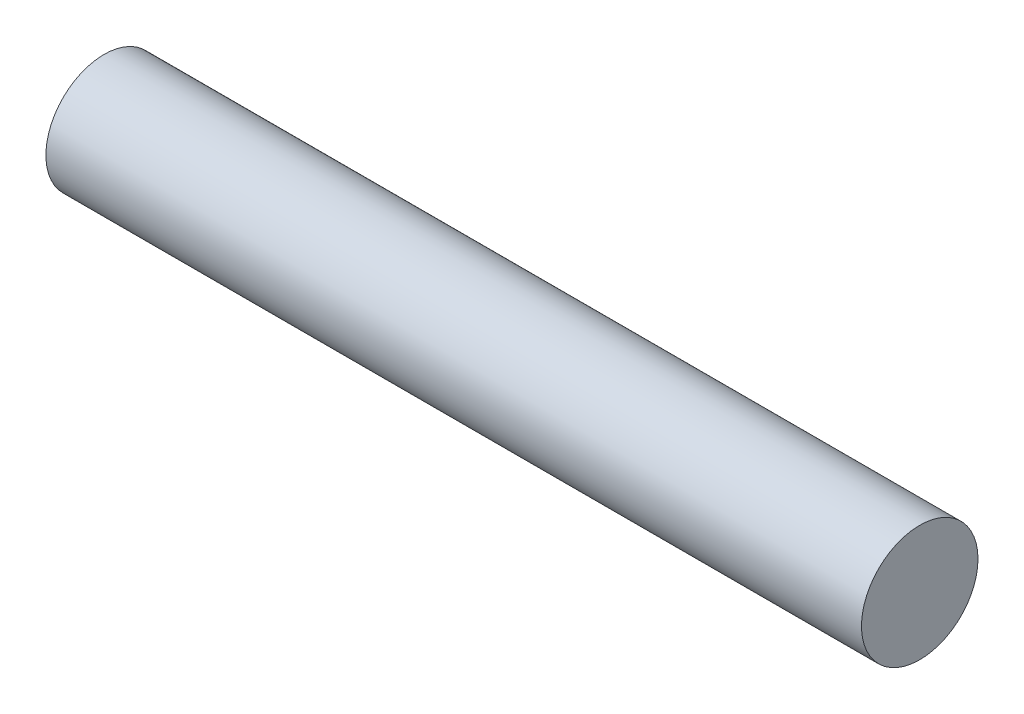
ISO-10303-21;
HEADER;
FILE_DESCRIPTION(('STEP AP214'),'2;1');
FILE_NAME('part.step','',(''),(''),'','','');
FILE_SCHEMA(('AUTOMOTIVE_DESIGN { 1 0 10303 214 1 1 1 1 }'));
ENDSEC;
DATA;
#1=APPLICATION_CONTEXT('core data for automotive mechanical design processes');
#2=APPLICATION_PROTOCOL_DEFINITION('international standard','automotive_design',2000,#1);
#3=PRODUCT_CONTEXT('',#1,'mechanical');
#4=PRODUCT('Part','Part','',(#3));
#5=PRODUCT_RELATED_PRODUCT_CATEGORY('part','',(#4));
#6=PRODUCT_DEFINITION_FORMATION('','',#4);
#7=PRODUCT_DEFINITION_CONTEXT('part definition',#1,'design');
#8=PRODUCT_DEFINITION('design','',#6,#7);
#9=PRODUCT_DEFINITION_SHAPE('','',#8);
#10=(LENGTH_UNIT() NAMED_UNIT(*) SI_UNIT(.MILLI.,.METRE.));
#11=(NAMED_UNIT(*) PLANE_ANGLE_UNIT() SI_UNIT($,.RADIAN.));
#12=(NAMED_UNIT(*) SI_UNIT($,.STERADIAN.) SOLID_ANGLE_UNIT());
#13=UNCERTAINTY_MEASURE_WITH_UNIT(LENGTH_MEASURE(1.E-05),#10,'distance_accuracy_value','');
#14=(GEOMETRIC_REPRESENTATION_CONTEXT(3) GLOBAL_UNCERTAINTY_ASSIGNED_CONTEXT((#13)) GLOBAL_UNIT_ASSIGNED_CONTEXT((#10,
#11,#12)) REPRESENTATION_CONTEXT('',''));
#15=CARTESIAN_POINT('',(0.,0.,0.));
#16=DIRECTION('',(0.,0.,1.));
#17=DIRECTION('',(1.,0.,0.));
#18=AXIS2_PLACEMENT_3D('',#15,#16,#17);
#19=CARTESIAN_POINT('',(105.,0.,0.));
#20=DIRECTION('',(-1.,0.,0.));
#21=DIRECTION('',(0.,0.,1.));
#22=AXIS2_PLACEMENT_3D('',#19,#20,#21);
#23=CYLINDRICAL_SURFACE('',#22,7.5);
#24=CARTESIAN_POINT('',(105.,0.,0.));
#25=DIRECTION('',(1.,0.,0.));
#26=DIRECTION('',(0.,0.,-1.));
#27=AXIS2_PLACEMENT_3D('',#24,#25,#26);
#28=CIRCLE('',#27,7.5);
#29=CARTESIAN_POINT('',(105.,0.,-7.5));
#30=VERTEX_POINT('',#29);
#31=EDGE_CURVE('E10',#30,#30,#28,.T.);
#32=ORIENTED_EDGE('',*,*,#31,.F.);
#33=EDGE_LOOP('',(#32));
#34=FACE_BOUND('',#33,.T.);
#35=CARTESIAN_POINT('',(0.,0.,0.));
#36=DIRECTION('',(1.,0.,0.));
#37=DIRECTION('',(0.,0.,-1.));
#38=AXIS2_PLACEMENT_3D('',#35,#36,#37);
#39=CIRCLE('',#38,7.5);
#40=CARTESIAN_POINT('',(0.,0.,-7.5));
#41=VERTEX_POINT('',#40);
#42=EDGE_CURVE('E33',#41,#41,#39,.T.);
#43=ORIENTED_EDGE('',*,*,#42,.T.);
#44=EDGE_LOOP('',(#43));
#45=FACE_BOUND('',#44,.T.);
#46=ADVANCED_FACE('F30',(#34,#45),#23,.T.);
#47=CARTESIAN_POINT('',(105.,0.,0.));
#48=DIRECTION('',(1.,0.,0.));
#49=DIRECTION('',(0.,0.,-1.));
#50=AXIS2_PLACEMENT_3D('',#47,#48,#49);
#51=PLANE('',#50);
#52=ORIENTED_EDGE('',*,*,#31,.T.);
#53=EDGE_LOOP('',(#52));
#54=FACE_BOUND('',#53,.T.);
#55=ADVANCED_FACE('F45',(#54),#51,.T.);
#56=CARTESIAN_POINT('',(0.,0.,0.));
#57=DIRECTION('',(1.,0.,0.));
#58=DIRECTION('',(0.,0.,-1.));
#59=AXIS2_PLACEMENT_3D('',#56,#57,#58);
#60=PLANE('',#59);
#61=ORIENTED_EDGE('',*,*,#42,.F.);
#62=EDGE_LOOP('',(#61));
#63=FACE_BOUND('',#62,.T.);
#64=ADVANCED_FACE('F43',(#63),#60,.F.);
#65=CLOSED_SHELL('',(#46,#55,#64));
#66=MANIFOLD_SOLID_BREP('B2',#65);
#67=ADVANCED_BREP_SHAPE_REPRESENTATION('',(#18,#66),#14);
#68=SHAPE_DEFINITION_REPRESENTATION(#9,#67);
ENDSEC;
END-ISO-10303-21;
